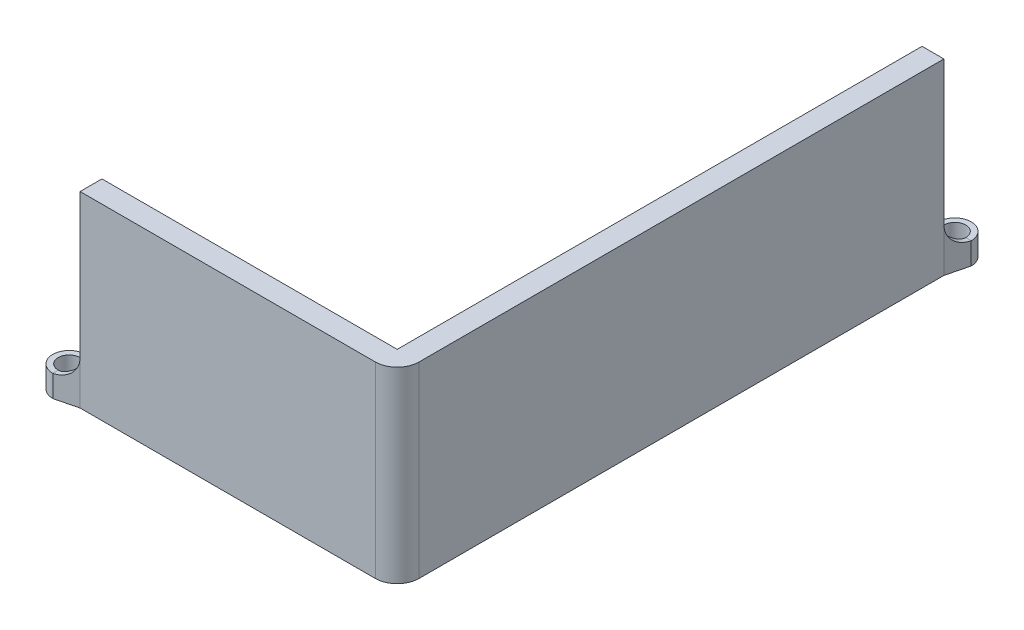
ISO-10303-21;
HEADER;
FILE_DESCRIPTION(('STEP AP214'),'2;1');
FILE_NAME('part.step','',(''),(''),'','','');
FILE_SCHEMA(('AUTOMOTIVE_DESIGN { 1 0 10303 214 1 1 1 1 }'));
ENDSEC;
DATA;
#1=APPLICATION_CONTEXT('core data for automotive mechanical design processes');
#2=APPLICATION_PROTOCOL_DEFINITION('international standard','automotive_design',2000,#1);
#3=PRODUCT_CONTEXT('',#1,'mechanical');
#4=PRODUCT('Part','Part','',(#3));
#5=PRODUCT_RELATED_PRODUCT_CATEGORY('part','',(#4));
#6=PRODUCT_DEFINITION_FORMATION('','',#4);
#7=PRODUCT_DEFINITION_CONTEXT('part definition',#1,'design');
#8=PRODUCT_DEFINITION('design','',#6,#7);
#9=PRODUCT_DEFINITION_SHAPE('','',#8);
#10=(LENGTH_UNIT() NAMED_UNIT(*) SI_UNIT(.MILLI.,.METRE.));
#11=(NAMED_UNIT(*) PLANE_ANGLE_UNIT() SI_UNIT($,.RADIAN.));
#12=(NAMED_UNIT(*) SI_UNIT($,.STERADIAN.) SOLID_ANGLE_UNIT());
#13=UNCERTAINTY_MEASURE_WITH_UNIT(LENGTH_MEASURE(1.E-05),#10,'distance_accuracy_value','');
#14=(GEOMETRIC_REPRESENTATION_CONTEXT(3) GLOBAL_UNCERTAINTY_ASSIGNED_CONTEXT((#13)) GLOBAL_UNIT_ASSIGNED_CONTEXT((#10,
#11,#12)) REPRESENTATION_CONTEXT('',''));
#15=CARTESIAN_POINT('',(0.,0.,0.));
#16=DIRECTION('',(0.,0.,1.));
#17=DIRECTION('',(1.,0.,0.));
#18=AXIS2_PLACEMENT_3D('',#15,#16,#17);
#19=CARTESIAN_POINT('',(-13.6180758017493,-8.50000000000001,2.));
#20=DIRECTION('',(1.,0.,0.));
#21=DIRECTION('',(0.,0.,-1.));
#22=AXIS2_PLACEMENT_3D('',#19,#20,#21);
#23=PLANE('',#22);
#24=DIRECTION('',(0.,-1.,0.));
#25=VECTOR('',#24,1.);
#26=CARTESIAN_POINT('',(-13.6180758017493,-8.50000000000001,0.));
#27=LINE('',#26,#25);
#28=CARTESIAN_POINT('',(-13.6180758017493,8.65000000000001,0.));
#29=VERTEX_POINT('',#28);
#30=CARTESIAN_POINT('',(-13.6180758017493,-4.50000000000001,0.));
#31=VERTEX_POINT('',#30);
#32=EDGE_CURVE('E346',#29,#31,#27,.T.);
#33=ORIENTED_EDGE('',*,*,#32,.T.);
#34=DIRECTION('',(0.,0.,-1.));
#35=VECTOR('',#34,1.);
#36=CARTESIAN_POINT('',(-13.6180758017493,-4.50000000000001,2.));
#37=LINE('',#36,#35);
#38=CARTESIAN_POINT('',(-13.6180758017493,-4.50000000000001,2.));
#39=VERTEX_POINT('',#38);
#40=EDGE_CURVE('E191',#31,#39,#37,.F.);
#41=ORIENTED_EDGE('',*,*,#40,.T.);
#42=DIRECTION('',(0.,-1.,0.));
#43=VECTOR('',#42,1.);
#44=CARTESIAN_POINT('',(-13.6180758017493,-8.50000000000001,2.));
#45=LINE('',#44,#43);
#46=CARTESIAN_POINT('',(-13.6180758017493,8.65000000000001,2.));
#47=VERTEX_POINT('',#46);
#48=EDGE_CURVE('E332',#47,#39,#45,.T.);
#49=ORIENTED_EDGE('',*,*,#48,.F.);
#50=DIRECTION('',(0.,0.,-1.));
#51=VECTOR('',#50,1.);
#52=CARTESIAN_POINT('',(-13.6180758017493,8.65000000000001,2.));
#53=LINE('',#52,#51);
#54=EDGE_CURVE('E340',#47,#29,#53,.T.);
#55=ORIENTED_EDGE('',*,*,#54,.T.);
#56=EDGE_LOOP('',(#33,#41,#49,#55));
#57=FACE_BOUND('',#56,.T.);
#58=ADVANCED_FACE('F45',(#57),#23,.F.);
#59=CARTESIAN_POINT('',(-13.6180758017493,8.65000000000001,2.));
#60=DIRECTION('',(0.,-1.,0.));
#61=DIRECTION('',(1.,0.,0.));
#62=AXIS2_PLACEMENT_3D('',#59,#60,#61);
#63=PLANE('',#62);
#64=DIRECTION('',(-1.,0.,0.));
#65=VECTOR('',#64,1.);
#66=CARTESIAN_POINT('',(-13.6180758017493,8.65000000000001,2.));
#67=LINE('',#66,#65);
#68=CARTESIAN_POINT('',(13.3819241982507,8.65000000000001,2.));
#69=VERTEX_POINT('',#68);
#70=EDGE_CURVE('E329',#69,#47,#67,.T.);
#71=ORIENTED_EDGE('',*,*,#70,.F.);
#72=CARTESIAN_POINT('',(13.3819241982507,8.65000000000001,0.));
#73=DIRECTION('',(0.,-1.,0.));
#74=DIRECTION('',(1.,0.,0.));
#75=AXIS2_PLACEMENT_3D('',#72,#73,#74);
#76=CIRCLE('',#75,2.);
#77=CARTESIAN_POINT('',(15.3819241982507,8.65000000000001,0.));
#78=VERTEX_POINT('',#77);
#79=EDGE_CURVE('E198',#69,#78,#76,.F.);
#80=ORIENTED_EDGE('',*,*,#79,.T.);
#81=DIRECTION('',(0.,0.,-1.));
#82=VECTOR('',#81,1.);
#83=CARTESIAN_POINT('',(15.3819241982507,8.65000000000001,0.));
#84=LINE('',#83,#82);
#85=CARTESIAN_POINT('',(15.3819241982507,8.65000000000001,-48.));
#86=VERTEX_POINT('',#85);
#87=EDGE_CURVE('E369',#78,#86,#84,.T.);
#88=ORIENTED_EDGE('',*,*,#87,.T.);
#89=DIRECTION('',(-1.,0.,0.));
#90=VECTOR('',#89,1.);
#91=CARTESIAN_POINT('',(15.3819241982507,8.65000000000001,-48.));
#92=LINE('',#91,#90);
#93=CARTESIAN_POINT('',(13.3819241982507,8.65000000000001,-48.));
#94=VERTEX_POINT('',#93);
#95=EDGE_CURVE('E325',#86,#94,#92,.T.);
#96=ORIENTED_EDGE('',*,*,#95,.T.);
#97=DIRECTION('',(0.,0.,-1.));
#98=VECTOR('',#97,1.);
#99=CARTESIAN_POINT('',(13.3819241982507,8.65000000000001,0.));
#100=LINE('',#99,#98);
#101=CARTESIAN_POINT('',(13.3819241982507,8.65000000000001,0.));
#102=VERTEX_POINT('',#101);
#103=EDGE_CURVE('E308',#102,#94,#100,.T.);
#104=ORIENTED_EDGE('',*,*,#103,.F.);
#105=DIRECTION('',(-1.,0.,0.));
#106=VECTOR('',#105,1.);
#107=CARTESIAN_POINT('',(-13.6180758017493,8.65000000000001,0.));
#108=LINE('',#107,#106);
#109=EDGE_CURVE('E343',#102,#29,#108,.T.);
#110=ORIENTED_EDGE('',*,*,#109,.T.);
#111=ORIENTED_EDGE('',*,*,#54,.F.);
#112=EDGE_LOOP('',(#71,#80,#88,#96,#104,#110,#111));
#113=FACE_BOUND('',#112,.T.);
#114=ADVANCED_FACE('F232',(#113),#63,.F.);
#115=CARTESIAN_POINT('',(-13.6180758017493,-8.50000000000001,2.));
#116=DIRECTION('',(0.,1.,0.));
#117=DIRECTION('',(0.,0.,1.));
#118=AXIS2_PLACEMENT_3D('',#115,#116,#117);
#119=PLANE('',#118);
#120=DIRECTION('',(0.,0.,-1.));
#121=VECTOR('',#120,1.);
#122=CARTESIAN_POINT('',(15.3819241982507,-8.50000000000001,0.));
#123=LINE('',#122,#121);
#124=CARTESIAN_POINT('',(15.3819241982507,-8.50000000000001,0.));
#125=VERTEX_POINT('',#124);
#126=CARTESIAN_POINT('',(15.3819241982507,-8.50000000000001,-48.));
#127=VERTEX_POINT('',#126);
#128=EDGE_CURVE('E320',#125,#127,#123,.T.);
#129=ORIENTED_EDGE('',*,*,#128,.F.);
#130=CARTESIAN_POINT('',(13.3819241982507,-8.50000000000001,0.));
#131=DIRECTION('',(0.,1.,0.));
#132=DIRECTION('',(0.,0.,1.));
#133=AXIS2_PLACEMENT_3D('',#130,#131,#132);
#134=CIRCLE('',#133,2.);
#135=CARTESIAN_POINT('',(13.3819241982507,-8.50000000000001,2.));
#136=VERTEX_POINT('',#135);
#137=EDGE_CURVE('E359',#125,#136,#134,.F.);
#138=ORIENTED_EDGE('',*,*,#137,.T.);
#139=DIRECTION('',(1.,0.,0.));
#140=VECTOR('',#139,1.);
#141=CARTESIAN_POINT('',(-13.6180758017493,-8.50000000000001,2.));
#142=LINE('',#141,#140);
#143=CARTESIAN_POINT('',(-13.6180758017493,-8.50000000000001,2.));
#144=VERTEX_POINT('',#143);
#145=EDGE_CURVE('E337',#144,#136,#142,.T.);
#146=ORIENTED_EDGE('',*,*,#145,.F.);
#147=DIRECTION('',(0.970142500145332,0.,-0.242535625036333));
#148=VECTOR('',#147,1.);
#149=CARTESIAN_POINT('',(-0.330475047161722,-8.50000000000001,-1.32190018864689));
#150=LINE('',#149,#148);
#151=CARTESIAN_POINT('',(-15.6180758017493,-8.50000000000001,2.5));
#152=VERTEX_POINT('',#151);
#153=EDGE_CURVE('E413',#152,#144,#150,.T.);
#154=ORIENTED_EDGE('',*,*,#153,.F.);
#155=CARTESIAN_POINT('',(-15.6180758017493,-8.50000000000001,1.));
#156=DIRECTION('',(0.,-1.,0.));
#157=DIRECTION('',(0.,0.,-1.));
#158=AXIS2_PLACEMENT_3D('',#155,#156,#157);
#159=CIRCLE('',#158,1.5);
#160=CARTESIAN_POINT('',(-15.6180758017493,-8.50000000000001,-0.5));
#161=VERTEX_POINT('',#160);
#162=EDGE_CURVE('E171',#152,#161,#159,.T.);
#163=ORIENTED_EDGE('',*,*,#162,.T.);
#164=DIRECTION('',(0.970142500145332,0.,0.242535625036333));
#165=VECTOR('',#164,1.);
#166=CARTESIAN_POINT('',(-0.801063282455839,-8.50000000000001,3.20425312982336));
#167=LINE('',#166,#165);
#168=CARTESIAN_POINT('',(-13.6180758017493,-8.50000000000001,0.));
#169=VERTEX_POINT('',#168);
#170=EDGE_CURVE('E415',#161,#169,#167,.T.);
#171=ORIENTED_EDGE('',*,*,#170,.T.);
#172=DIRECTION('',(1.,0.,0.));
#173=VECTOR('',#172,1.);
#174=CARTESIAN_POINT('',(-13.6180758017493,-8.50000000000001,0.));
#175=LINE('',#174,#173);
#176=CARTESIAN_POINT('',(13.3819241982507,-8.50000000000001,0.));
#177=VERTEX_POINT('',#176);
#178=EDGE_CURVE('E333',#169,#177,#175,.T.);
#179=ORIENTED_EDGE('',*,*,#178,.T.);
#180=DIRECTION('',(0.,0.,-1.));
#181=VECTOR('',#180,1.);
#182=CARTESIAN_POINT('',(13.3819241982507,-8.50000000000001,0.));
#183=LINE('',#182,#181);
#184=CARTESIAN_POINT('',(13.3819241982507,-8.50000000000001,-48.));
#185=VERTEX_POINT('',#184);
#186=EDGE_CURVE('E315',#177,#185,#183,.T.);
#187=ORIENTED_EDGE('',*,*,#186,.T.);
#188=DIRECTION('',(0.242535625036332,0.,0.970142500145332));
#189=VECTOR('',#188,1.);
#190=CARTESIAN_POINT('',(23.8888698336477,-8.50000000000001,-5.97221745841191));
#191=LINE('',#190,#189);
#192=CARTESIAN_POINT('',(12.8819241982507,-8.50000000000001,-50.));
#193=VERTEX_POINT('',#192);
#194=EDGE_CURVE('E393',#193,#185,#191,.T.);
#195=ORIENTED_EDGE('',*,*,#194,.F.);
#196=CARTESIAN_POINT('',(14.3819241982507,-8.50000000000001,-50.));
#197=DIRECTION('',(0.,-1.,0.));
#198=DIRECTION('',(0.,0.,-1.));
#199=AXIS2_PLACEMENT_3D('',#196,#197,#198);
#200=CIRCLE('',#199,1.5);
#201=CARTESIAN_POINT('',(15.8819241982507,-8.50000000000001,-50.));
#202=VERTEX_POINT('',#201);
#203=EDGE_CURVE('E397',#193,#202,#200,.T.);
#204=ORIENTED_EDGE('',*,*,#203,.T.);
#205=DIRECTION('',(-0.242535625036331,0.,0.970142500145332));
#206=VECTOR('',#205,1.);
#207=CARTESIAN_POINT('',(3.18298748070665,-8.50000000000001,0.795746870176657));
#208=LINE('',#207,#206);
#209=EDGE_CURVE('E401',#202,#127,#208,.T.);
#210=ORIENTED_EDGE('',*,*,#209,.T.);
#211=EDGE_LOOP('',(#129,#138,#146,#154,#163,#171,#179,#187,#195,#204,#210));
#212=FACE_BOUND('',#211,.T.);
#213=CARTESIAN_POINT('',(14.3819241982507,-8.50000000000001,-50.));
#214=DIRECTION('',(0.,-1.,0.));
#215=DIRECTION('',(0.,0.,-1.));
#216=AXIS2_PLACEMENT_3D('',#213,#214,#215);
#217=CIRCLE('',#216,1.);
#218=CARTESIAN_POINT('',(14.3819241982507,-8.50000000000001,-51.));
#219=VERTEX_POINT('',#218);
#220=EDGE_CURVE('E388',#219,#219,#217,.T.);
#221=ORIENTED_EDGE('',*,*,#220,.F.);
#222=EDGE_LOOP('',(#221));
#223=FACE_BOUND('',#222,.T.);
#224=CARTESIAN_POINT('',(-15.6180758017493,-8.50000000000001,1.));
#225=DIRECTION('',(0.,-1.,0.));
#226=DIRECTION('',(0.,0.,-1.));
#227=AXIS2_PLACEMENT_3D('',#224,#225,#226);
#228=CIRCLE('',#227,1.);
#229=CARTESIAN_POINT('',(-15.6180758017493,-8.50000000000001,0.));
#230=VERTEX_POINT('',#229);
#231=EDGE_CURVE('E417',#230,#230,#228,.T.);
#232=ORIENTED_EDGE('',*,*,#231,.F.);
#233=EDGE_LOOP('',(#232));
#234=FACE_BOUND('',#233,.T.);
#235=ADVANCED_FACE('F235',(#212,#223,#234),#119,.F.);
#236=CARTESIAN_POINT('',(0.,0.,2.));
#237=DIRECTION('',(0.,0.,-1.));
#238=DIRECTION('',(-1.,0.,0.));
#239=AXIS2_PLACEMENT_3D('',#236,#237,#238);
#240=PLANE('',#239);
#241=ORIENTED_EDGE('',*,*,#145,.T.);
#242=DIRECTION('',(0.,-1.,0.));
#243=VECTOR('',#242,1.);
#244=CARTESIAN_POINT('',(13.3819241982507,8.65000000000001,2.));
#245=LINE('',#244,#243);
#246=EDGE_CURVE('E362',#136,#69,#245,.F.);
#247=ORIENTED_EDGE('',*,*,#246,.T.);
#248=ORIENTED_EDGE('',*,*,#70,.T.);
#249=ORIENTED_EDGE('',*,*,#48,.T.);
#250=DIRECTION('',(0.,-1.,0.));
#251=VECTOR('',#250,1.);
#252=CARTESIAN_POINT('',(-13.6180758017493,-6.50000000000001,2.));
#253=LINE('',#252,#251);
#254=EDGE_CURVE('E154',#39,#144,#253,.T.);
#255=ORIENTED_EDGE('',*,*,#254,.T.);
#256=EDGE_LOOP('',(#241,#247,#248,#249,#255));
#257=FACE_BOUND('',#256,.T.);
#258=ADVANCED_FACE('F242',(#257),#240,.F.);
#259=CARTESIAN_POINT('',(0.,0.,0.));
#260=DIRECTION('',(0.,0.,-1.));
#261=DIRECTION('',(-1.,0.,0.));
#262=AXIS2_PLACEMENT_3D('',#259,#260,#261);
#263=PLANE('',#262);
#264=DIRECTION('',(0.,1.,0.));
#265=VECTOR('',#264,1.);
#266=CARTESIAN_POINT('',(13.3819241982507,-8.50000000000001,0.));
#267=LINE('',#266,#265);
#268=EDGE_CURVE('E328',#177,#102,#267,.T.);
#269=ORIENTED_EDGE('',*,*,#268,.F.);
#270=ORIENTED_EDGE('',*,*,#178,.F.);
#271=DIRECTION('',(0.,-1.,0.));
#272=VECTOR('',#271,1.);
#273=CARTESIAN_POINT('',(-13.6180758017493,-6.50000000000001,0.));
#274=LINE('',#273,#272);
#275=EDGE_CURVE('E185',#31,#169,#274,.T.);
#276=ORIENTED_EDGE('',*,*,#275,.F.);
#277=ORIENTED_EDGE('',*,*,#32,.F.);
#278=ORIENTED_EDGE('',*,*,#109,.F.);
#279=EDGE_LOOP('',(#269,#270,#276,#277,#278));
#280=FACE_BOUND('',#279,.T.);
#281=ADVANCED_FACE('F244',(#280),#263,.T.);
#282=CARTESIAN_POINT('',(13.3819241982507,0.,0.));
#283=DIRECTION('',(1.,0.,0.));
#284=DIRECTION('',(0.,0.,-1.));
#285=AXIS2_PLACEMENT_3D('',#282,#283,#284);
#286=PLANE('',#285);
#287=ORIENTED_EDGE('',*,*,#186,.F.);
#288=ORIENTED_EDGE('',*,*,#268,.T.);
#289=ORIENTED_EDGE('',*,*,#103,.T.);
#290=DIRECTION('',(0.,-1.,0.));
#291=VECTOR('',#290,1.);
#292=CARTESIAN_POINT('',(13.3819241982507,0.,-48.));
#293=LINE('',#292,#291);
#294=CARTESIAN_POINT('',(13.3819241982507,-4.50000000000001,-48.));
#295=VERTEX_POINT('',#294);
#296=EDGE_CURVE('E300',#94,#295,#293,.T.);
#297=ORIENTED_EDGE('',*,*,#296,.T.);
#298=DIRECTION('',(0.,-1.,0.));
#299=VECTOR('',#298,1.);
#300=CARTESIAN_POINT('',(13.3819241982507,-6.50000000000001,-48.));
#301=LINE('',#300,#299);
#302=EDGE_CURVE('E304',#295,#185,#301,.T.);
#303=ORIENTED_EDGE('',*,*,#302,.T.);
#304=EDGE_LOOP('',(#287,#288,#289,#297,#303));
#305=FACE_BOUND('',#304,.T.);
#306=ADVANCED_FACE('F247',(#305),#286,.F.);
#307=CARTESIAN_POINT('',(15.3819241982507,0.,-48.));
#308=DIRECTION('',(0.,0.,-1.));
#309=DIRECTION('',(-1.,0.,0.));
#310=AXIS2_PLACEMENT_3D('',#307,#308,#309);
#311=PLANE('',#310);
#312=DIRECTION('',(0.,-1.,0.));
#313=VECTOR('',#312,1.);
#314=CARTESIAN_POINT('',(15.3819241982507,0.,-48.));
#315=LINE('',#314,#313);
#316=CARTESIAN_POINT('',(15.3819241982507,-4.50000000000001,-48.));
#317=VERTEX_POINT('',#316);
#318=EDGE_CURVE('E301',#86,#317,#315,.T.);
#319=ORIENTED_EDGE('',*,*,#318,.T.);
#320=DIRECTION('',(1.,0.,0.));
#321=VECTOR('',#320,1.);
#322=CARTESIAN_POINT('',(15.3819241982507,-4.50000000000001,-48.));
#323=LINE('',#322,#321);
#324=EDGE_CURVE('E208',#317,#295,#323,.F.);
#325=ORIENTED_EDGE('',*,*,#324,.T.);
#326=ORIENTED_EDGE('',*,*,#296,.F.);
#327=ORIENTED_EDGE('',*,*,#95,.F.);
#328=EDGE_LOOP('',(#319,#325,#326,#327));
#329=FACE_BOUND('',#328,.T.);
#330=ADVANCED_FACE('F252',(#329),#311,.T.);
#331=CARTESIAN_POINT('',(15.3819241982507,0.,0.));
#332=DIRECTION('',(1.,0.,0.));
#333=DIRECTION('',(0.,0.,-1.));
#334=AXIS2_PLACEMENT_3D('',#331,#332,#333);
#335=PLANE('',#334);
#336=ORIENTED_EDGE('',*,*,#87,.F.);
#337=DIRECTION('',(0.,-1.,0.));
#338=VECTOR('',#337,1.);
#339=CARTESIAN_POINT('',(15.3819241982507,-8.50000000000001,0.));
#340=LINE('',#339,#338);
#341=EDGE_CURVE('E355',#78,#125,#340,.T.);
#342=ORIENTED_EDGE('',*,*,#341,.T.);
#343=ORIENTED_EDGE('',*,*,#128,.T.);
#344=DIRECTION('',(0.,-1.,0.));
#345=VECTOR('',#344,1.);
#346=CARTESIAN_POINT('',(15.3819241982507,-6.50000000000001,-48.));
#347=LINE('',#346,#345);
#348=EDGE_CURVE('E63',#317,#127,#347,.T.);
#349=ORIENTED_EDGE('',*,*,#348,.F.);
#350=ORIENTED_EDGE('',*,*,#318,.F.);
#351=EDGE_LOOP('',(#336,#342,#343,#349,#350));
#352=FACE_BOUND('',#351,.T.);
#353=ADVANCED_FACE('F230',(#352),#335,.T.);
#354=CARTESIAN_POINT('',(13.3819241982507,0.,0.));
#355=DIRECTION('',(0.,1.,0.));
#356=DIRECTION('',(0.,0.,1.));
#357=AXIS2_PLACEMENT_3D('',#354,#355,#356);
#358=CYLINDRICAL_SURFACE('',#357,2.);
#359=ORIENTED_EDGE('',*,*,#79,.F.);
#360=ORIENTED_EDGE('',*,*,#246,.F.);
#361=ORIENTED_EDGE('',*,*,#137,.F.);
#362=ORIENTED_EDGE('',*,*,#341,.F.);
#363=EDGE_LOOP('',(#359,#360,#361,#362));
#364=FACE_BOUND('',#363,.T.);
#365=ADVANCED_FACE('F226',(#364),#358,.T.);
#366=CARTESIAN_POINT('',(23.8888698336477,-6.50000000000001,-5.97221745841191));
#367=DIRECTION('',(0.970142500145332,0.,-0.242535625036332));
#368=DIRECTION('',(-0.242535625036332,0.,-0.970142500145332));
#369=AXIS2_PLACEMENT_3D('',#366,#367,#368);
#370=PLANE('',#369);
#371=ORIENTED_EDGE('',*,*,#194,.T.);
#372=ORIENTED_EDGE('',*,*,#302,.F.);
#373=CARTESIAN_POINT('',(12.8819241982507,-4.50000000000001,-50.));
#374=DIRECTION('',(0.970142500145332,0.,-0.242535625036332));
#375=DIRECTION('',(0.242535625036332,0.,0.970142500145332));
#376=AXIS2_PLACEMENT_3D('',#373,#374,#375);
#377=ELLIPSE('',#376,2.06155281280883,2.);
#378=CARTESIAN_POINT('',(12.8819241982507,-6.50000000000001,-50.));
#379=VERTEX_POINT('',#378);
#380=EDGE_CURVE('E11',#295,#379,#377,.T.);
#381=ORIENTED_EDGE('',*,*,#380,.T.);
#382=DIRECTION('',(0.,-1.,0.));
#383=VECTOR('',#382,1.);
#384=CARTESIAN_POINT('',(12.8819241982507,-6.50000000000001,-50.));
#385=LINE('',#384,#383);
#386=EDGE_CURVE('E392',#379,#193,#385,.T.);
#387=ORIENTED_EDGE('',*,*,#386,.T.);
#388=EDGE_LOOP('',(#371,#372,#381,#387));
#389=FACE_BOUND('',#388,.T.);
#390=ADVANCED_FACE('F229',(#389),#370,.F.);
#391=CARTESIAN_POINT('',(3.18298748070665,-6.50000000000001,0.795746870176657));
#392=DIRECTION('',(0.970142500145332,0.,0.242535625036331));
#393=DIRECTION('',(0.242535625036331,0.,-0.970142500145332));
#394=AXIS2_PLACEMENT_3D('',#391,#392,#393);
#395=PLANE('',#394);
#396=ORIENTED_EDGE('',*,*,#209,.F.);
#397=DIRECTION('',(0.,-1.,0.));
#398=VECTOR('',#397,1.);
#399=CARTESIAN_POINT('',(15.8819241982507,-6.50000000000001,-50.));
#400=LINE('',#399,#398);
#401=CARTESIAN_POINT('',(15.8819241982507,-6.50000000000001,-50.));
#402=VERTEX_POINT('',#401);
#403=EDGE_CURVE('E291',#402,#202,#400,.T.);
#404=ORIENTED_EDGE('',*,*,#403,.F.);
#405=CARTESIAN_POINT('',(15.8819241982507,-4.50000000000001,-50.));
#406=DIRECTION('',(0.970142500145332,0.,0.242535625036331));
#407=DIRECTION('',(0.242535625036331,0.,-0.970142500145332));
#408=AXIS2_PLACEMENT_3D('',#405,#406,#407);
#409=ELLIPSE('',#408,2.06155281280883,2.);
#410=EDGE_CURVE('E56',#402,#317,#409,.F.);
#411=ORIENTED_EDGE('',*,*,#410,.T.);
#412=ORIENTED_EDGE('',*,*,#348,.T.);
#413=EDGE_LOOP('',(#396,#404,#411,#412));
#414=FACE_BOUND('',#413,.T.);
#415=ADVANCED_FACE('F263',(#414),#395,.T.);
#416=CARTESIAN_POINT('',(14.3819241982507,-6.50000000000001,-50.));
#417=DIRECTION('',(0.,-1.,0.));
#418=DIRECTION('',(0.,0.,-1.));
#419=AXIS2_PLACEMENT_3D('',#416,#417,#418);
#420=CYLINDRICAL_SURFACE('',#419,1.5);
#421=ORIENTED_EDGE('',*,*,#203,.F.);
#422=ORIENTED_EDGE('',*,*,#386,.F.);
#423=CARTESIAN_POINT('',(14.3819241982507,-6.50000000000001,-50.));
#424=DIRECTION('',(0.,-1.,0.));
#425=DIRECTION('',(0.,0.,-1.));
#426=AXIS2_PLACEMENT_3D('',#423,#424,#425);
#427=CIRCLE('',#426,1.5);
#428=EDGE_CURVE('E385',#379,#402,#427,.T.);
#429=ORIENTED_EDGE('',*,*,#428,.T.);
#430=ORIENTED_EDGE('',*,*,#403,.T.);
#431=EDGE_LOOP('',(#421,#422,#429,#430));
#432=FACE_BOUND('',#431,.T.);
#433=ADVANCED_FACE('F265',(#432),#420,.T.);
#434=CARTESIAN_POINT('',(14.3819241982507,-6.50000000000001,-50.));
#435=DIRECTION('',(0.,-1.,0.));
#436=DIRECTION('',(0.,0.,-1.));
#437=AXIS2_PLACEMENT_3D('',#434,#435,#436);
#438=CYLINDRICAL_SURFACE('',#437,1.);
#439=CARTESIAN_POINT('',(14.3819241982507,-6.50000000000001,-50.));
#440=DIRECTION('',(0.,-1.,0.));
#441=DIRECTION('',(0.,0.,-1.));
#442=AXIS2_PLACEMENT_3D('',#439,#440,#441);
#443=CIRCLE('',#442,1.);
#444=CARTESIAN_POINT('',(13.3819241982507,-6.50000000000001,-50.));
#445=VERTEX_POINT('',#444);
#446=CARTESIAN_POINT('',(15.3819241982507,-6.50000000000001,-50.));
#447=VERTEX_POINT('',#446);
#448=EDGE_CURVE('E387',#445,#447,#443,.T.);
#449=ORIENTED_EDGE('',*,*,#448,.F.);
#450=CARTESIAN_POINT('',(13.3819241982507,-6.50000000000001,-50.));
#451=CARTESIAN_POINT('',(13.3819227955202,-6.50000269946716,-49.9735948077034));
#452=CARTESIAN_POINT('',(13.3829707665138,-6.49947649716798,-49.9472036520922));
#453=CARTESIAN_POINT('',(13.3871410325556,-6.49739548241972,-49.8946369973913));
#454=CARTESIAN_POINT('',(13.3902624945881,-6.49584108304528,-49.8684614159694));
#455=CARTESIAN_POINT('',(13.4026571146314,-6.48970082418063,-49.7907872526912));
#456=CARTESIAN_POINT('',(13.4149611271375,-6.48363725114636,-49.7398530951311));
#457=CARTESIAN_POINT('',(13.4471094259117,-6.46816726842188,-49.6410822692348));
#458=CARTESIAN_POINT('',(13.4669450884225,-6.45876468270353,-49.5932421312851));
#459=CARTESIAN_POINT('',(13.5134658730641,-6.43747056331368,-49.5015778196361));
#460=CARTESIAN_POINT('',(13.5401578404674,-6.42557654442051,-49.4577577191899));
#461=CARTESIAN_POINT('',(13.601443119084,-6.39956190172718,-49.372488998072));
#462=CARTESIAN_POINT('',(13.6364143256194,-6.38535051613387,-49.3313402655673));
#463=CARTESIAN_POINT('',(13.7124499384799,-6.35659818763131,-49.2552171611083));
#464=CARTESIAN_POINT('',(13.7535183173906,-6.3420570351368,-49.2202468474539));
#465=CARTESIAN_POINT('',(13.8444081089623,-6.31298933446051,-49.1547475255989));
#466=CARTESIAN_POINT('',(13.8946614975898,-6.29855152537611,-49.1247739300601));
#467=CARTESIAN_POINT('',(14.0002928579138,-6.27285951753638,-49.0738312896018));
#468=CARTESIAN_POINT('',(14.0556670107007,-6.26160297130255,-49.0528555991083));
#469=CARTESIAN_POINT('',(14.1665886919371,-6.2445787641064,-49.0218677239291));
#470=CARTESIAN_POINT('',(14.2219273899908,-6.23852285222135,-49.0112743815781));
#471=CARTESIAN_POINT('',(14.3339017466554,-6.23181891602507,-48.9995730347665));
#472=CARTESIAN_POINT('',(14.3905360998552,-6.2311656698563,-48.9984558712346));
#473=CARTESIAN_POINT('',(14.4962107594095,-6.23510932236025,-49.0053127467042));
#474=CARTESIAN_POINT('',(14.5453492951127,-6.23908772332738,-49.0122155887197));
#475=CARTESIAN_POINT('',(14.6416471314673,-6.25076245394119,-49.0330604550174));
#476=CARTESIAN_POINT('',(14.6888058399225,-6.25845988751499,-49.0470045694287));
#477=CARTESIAN_POINT('',(14.781152683654,-6.27687463485512,-49.0817899693375));
#478=CARTESIAN_POINT('',(14.826269344758,-6.28765810604009,-49.1027843255804));
#479=CARTESIAN_POINT('',(14.9125573566277,-6.31103369680029,-49.1509575871545));
#480=CARTESIAN_POINT('',(14.9537268133975,-6.32362667746669,-49.1781394405476));
#481=CARTESIAN_POINT('',(15.0364440832088,-6.35113112116197,-49.2419327936044));
#482=CARTESIAN_POINT('',(15.0773784754602,-6.36613414138213,-49.2793028008289));
#483=CARTESIAN_POINT('',(15.1526575619626,-6.39547538192715,-49.3604421486319));
#484=CARTESIAN_POINT('',(15.1869986982835,-6.4098132401625,-49.4042149220255));
#485=CARTESIAN_POINT('',(15.2496258089266,-6.43702678121635,-49.499506473959));
#486=CARTESIAN_POINT('',(15.2775519334265,-6.44980225177332,-49.5512923848146));
#487=CARTESIAN_POINT('',(15.3240412679907,-6.47158856967769,-49.6595979435401));
#488=CARTESIAN_POINT('',(15.3426213108492,-6.48060618006931,-49.7161088656938));
#489=CARTESIAN_POINT('',(15.3646115731507,-6.49138632543685,-49.8108983931179));
#490=CARTESIAN_POINT('',(15.3710816786373,-6.49459484825626,-49.8483281553093));
#491=CARTESIAN_POINT('',(15.3797460794436,-6.4989107546555,-49.9238275392058));
#492=CARTESIAN_POINT('',(15.3819369018349,-6.5000164316142,-49.9618976553525));
#493=CARTESIAN_POINT('',(15.3819241982507,-6.50000000000001,-50.));
#494=B_SPLINE_CURVE_WITH_KNOTS('',3,(#450,#451,#452,#453,#454,#455,#456,#457,#458,#459,#460,
#461,#462,#463,#464,#465,#466,#467,#468,#469,#470,#471,#472,#473,#474,#475,#476,#477,#478,#479,
#480,#481,#482,#483,#484,#485,#486,#487,#488,#489,#490,#491,#492,#493),.UNSPECIFIED.,.F.,.F.,(4,
2,2,2,2,2,2,2,2,2,2,2,2,2,2,2,2,2,2,2,2,4),(0.,0.0791624071485603,0.158293030372253,
0.315701742302616,0.472930761738357,0.630317371504209,0.797144021853112,0.964079848299636,
1.14397301600195,1.32373309046489,1.49273181845563,1.6615671843976,1.81021234232053,
1.95890164998501,2.11105391388271,2.26327882374109,2.43479774097341,2.60640895669909,
2.78607476153255,2.96541580950668,3.07949288403012,3.19366250143093),.UNSPECIFIED.);
#495=EDGE_CURVE('E160',#445,#447,#494,.T.);
#496=ORIENTED_EDGE('',*,*,#495,.T.);
#497=EDGE_LOOP('',(#449,#496));
#498=FACE_BOUND('',#497,.T.);
#499=ORIENTED_EDGE('',*,*,#220,.T.);
#500=EDGE_LOOP('',(#499));
#501=FACE_BOUND('',#500,.T.);
#502=ADVANCED_FACE('F268',(#498,#501),#438,.F.);
#503=CARTESIAN_POINT('',(0.,-6.50000000000001,0.));
#504=DIRECTION('',(0.,-1.,0.));
#505=DIRECTION('',(0.,0.,-1.));
#506=AXIS2_PLACEMENT_3D('',#503,#504,#505);
#507=PLANE('',#506);
#508=ORIENTED_EDGE('',*,*,#428,.F.);
#509=DIRECTION('',(1.,0.,0.));
#510=VECTOR('',#509,1.);
#511=CARTESIAN_POINT('',(0.,-6.50000000000001,-50.));
#512=LINE('',#511,#510);
#513=EDGE_CURVE('E204',#379,#445,#512,.T.);
#514=ORIENTED_EDGE('',*,*,#513,.T.);
#515=ORIENTED_EDGE('',*,*,#448,.T.);
#516=DIRECTION('',(1.,0.,0.));
#517=VECTOR('',#516,1.);
#518=CARTESIAN_POINT('',(0.,-6.50000000000001,-50.));
#519=LINE('',#518,#517);
#520=EDGE_CURVE('E195',#447,#402,#519,.T.);
#521=ORIENTED_EDGE('',*,*,#520,.T.);
#522=EDGE_LOOP('',(#508,#514,#515,#521));
#523=FACE_BOUND('',#522,.T.);
#524=ADVANCED_FACE('F275',(#523),#507,.F.);
#525=CARTESIAN_POINT('',(-0.801063282455839,-6.50000000000001,3.20425312982336));
#526=DIRECTION('',(0.242535625036333,0.,-0.970142500145332));
#527=DIRECTION('',(-0.970142500145332,0.,-0.242535625036333));
#528=AXIS2_PLACEMENT_3D('',#525,#526,#527);
#529=PLANE('',#528);
#530=ORIENTED_EDGE('',*,*,#170,.F.);
#531=DIRECTION('',(0.,-1.,0.));
#532=VECTOR('',#531,1.);
#533=CARTESIAN_POINT('',(-15.6180758017493,-6.50000000000001,-0.5));
#534=LINE('',#533,#532);
#535=CARTESIAN_POINT('',(-15.6180758017493,-6.50000000000001,-0.5));
#536=VERTEX_POINT('',#535);
#537=EDGE_CURVE('E173',#536,#161,#534,.T.);
#538=ORIENTED_EDGE('',*,*,#537,.F.);
#539=CARTESIAN_POINT('',(-15.6180758017493,-4.50000000000001,-0.5));
#540=DIRECTION('',(0.242535625036333,0.,-0.970142500145332));
#541=DIRECTION('',(0.970142500145332,0.,0.242535625036333));
#542=AXIS2_PLACEMENT_3D('',#539,#540,#541);
#543=ELLIPSE('',#542,2.06155281280883,2.);
#544=EDGE_CURVE('E161',#536,#31,#543,.F.);
#545=ORIENTED_EDGE('',*,*,#544,.T.);
#546=ORIENTED_EDGE('',*,*,#275,.T.);
#547=EDGE_LOOP('',(#530,#538,#545,#546));
#548=FACE_BOUND('',#547,.T.);
#549=ADVANCED_FACE('F431',(#548),#529,.T.);
#550=CARTESIAN_POINT('',(-15.6180758017493,-6.50000000000001,1.));
#551=DIRECTION('',(0.,-1.,0.));
#552=DIRECTION('',(0.,0.,-1.));
#553=AXIS2_PLACEMENT_3D('',#550,#551,#552);
#554=CYLINDRICAL_SURFACE('',#553,1.5);
#555=ORIENTED_EDGE('',*,*,#162,.F.);
#556=DIRECTION('',(0.,-1.,0.));
#557=VECTOR('',#556,1.);
#558=CARTESIAN_POINT('',(-15.6180758017493,-6.50000000000001,2.5));
#559=LINE('',#558,#557);
#560=CARTESIAN_POINT('',(-15.6180758017493,-6.50000000000001,2.5));
#561=VERTEX_POINT('',#560);
#562=EDGE_CURVE('E152',#561,#152,#559,.T.);
#563=ORIENTED_EDGE('',*,*,#562,.F.);
#564=CARTESIAN_POINT('',(-15.6180758017493,-6.50000000000001,1.));
#565=DIRECTION('',(0.,-1.,0.));
#566=DIRECTION('',(0.,0.,-1.));
#567=AXIS2_PLACEMENT_3D('',#564,#565,#566);
#568=CIRCLE('',#567,1.5);
#569=EDGE_CURVE('E168',#561,#536,#568,.T.);
#570=ORIENTED_EDGE('',*,*,#569,.T.);
#571=ORIENTED_EDGE('',*,*,#537,.T.);
#572=EDGE_LOOP('',(#555,#563,#570,#571));
#573=FACE_BOUND('',#572,.T.);
#574=ADVANCED_FACE('F167',(#573),#554,.T.);
#575=CARTESIAN_POINT('',(-0.330475047161722,-6.50000000000001,-1.32190018864689));
#576=DIRECTION('',(-0.242535625036333,0.,-0.970142500145332));
#577=DIRECTION('',(-0.970142500145332,0.,0.242535625036333));
#578=AXIS2_PLACEMENT_3D('',#575,#576,#577);
#579=PLANE('',#578);
#580=ORIENTED_EDGE('',*,*,#153,.T.);
#581=ORIENTED_EDGE('',*,*,#254,.F.);
#582=CARTESIAN_POINT('',(-15.6180758017493,-4.50000000000001,2.5));
#583=DIRECTION('',(-0.242535625036333,0.,-0.970142500145332));
#584=DIRECTION('',(-0.970142500145332,0.,0.242535625036333));
#585=AXIS2_PLACEMENT_3D('',#582,#583,#584);
#586=ELLIPSE('',#585,2.06155281280883,2.);
#587=EDGE_CURVE('E148',#39,#561,#586,.T.);
#588=ORIENTED_EDGE('',*,*,#587,.T.);
#589=ORIENTED_EDGE('',*,*,#562,.T.);
#590=EDGE_LOOP('',(#580,#581,#588,#589));
#591=FACE_BOUND('',#590,.T.);
#592=ADVANCED_FACE('F151',(#591),#579,.F.);
#593=CARTESIAN_POINT('',(-15.6180758017493,-6.50000000000001,1.));
#594=DIRECTION('',(0.,-1.,0.));
#595=DIRECTION('',(0.,0.,-1.));
#596=AXIS2_PLACEMENT_3D('',#593,#594,#595);
#597=CYLINDRICAL_SURFACE('',#596,1.);
#598=CARTESIAN_POINT('',(-15.6180758017493,-6.50000000000001,1.));
#599=DIRECTION('',(0.,-1.,0.));
#600=DIRECTION('',(0.,0.,-1.));
#601=AXIS2_PLACEMENT_3D('',#598,#599,#600);
#602=CIRCLE('',#601,1.);
#603=CARTESIAN_POINT('',(-15.6180758017493,-6.50000000000001,2.));
#604=VERTEX_POINT('',#603);
#605=CARTESIAN_POINT('',(-15.6180758017493,-6.50000000000001,0.));
#606=VERTEX_POINT('',#605);
#607=EDGE_CURVE('E186',#604,#606,#602,.T.);
#608=ORIENTED_EDGE('',*,*,#607,.F.);
#609=CARTESIAN_POINT('',(-15.6180758017493,-6.50000000000001,2.));
#610=CARTESIAN_POINT('',(-15.5916706094527,-6.50000269946715,2.00000140273049));
#611=CARTESIAN_POINT('',(-15.5652794538415,-6.49947649716798,1.99895343173695));
#612=CARTESIAN_POINT('',(-15.5127127991406,-6.49739548241972,1.99478316569516));
#613=CARTESIAN_POINT('',(-15.4865372177187,-6.49584108304528,1.99166170366266));
#614=CARTESIAN_POINT('',(-15.4088630544404,-6.48970082418064,1.9792670836193));
#615=CARTESIAN_POINT('',(-15.3579288968804,-6.48363725114636,1.96696307111327));
#616=CARTESIAN_POINT('',(-15.2591580709841,-6.46816726842188,1.93481477233904));
#617=CARTESIAN_POINT('',(-15.2113179330344,-6.45876468270353,1.91497910982818));
#618=CARTESIAN_POINT('',(-15.1196536213853,-6.43747056331368,1.86845832518665));
#619=CARTESIAN_POINT('',(-15.0758335209391,-6.42557654442051,1.8417663577833));
#620=CARTESIAN_POINT('',(-14.9905647998213,-6.39956190172718,1.78048107916673));
#621=CARTESIAN_POINT('',(-14.9494160673166,-6.38535051613387,1.74550987263135));
#622=CARTESIAN_POINT('',(-14.8732929628576,-6.35659818763131,1.66947425977087));
#623=CARTESIAN_POINT('',(-14.8383226492032,-6.3420570351368,1.62840588086014));
#624=CARTESIAN_POINT('',(-14.7728233273481,-6.31298933446052,1.53751608928843));
#625=CARTESIAN_POINT('',(-14.7428497318094,-6.29855152537611,1.48726270066095));
#626=CARTESIAN_POINT('',(-14.6919070913511,-6.27285951753638,1.38163134033696));
#627=CARTESIAN_POINT('',(-14.6709314008576,-6.26160297130256,1.32625718755001));
#628=CARTESIAN_POINT('',(-14.6399435256784,-6.2445787641064,1.21533550631358));
#629=CARTESIAN_POINT('',(-14.6293501833274,-6.23852285222135,1.15999680825996));
#630=CARTESIAN_POINT('',(-14.6176488365158,-6.23181891602507,1.04802245159529));
#631=CARTESIAN_POINT('',(-14.6165316729839,-6.2311656698563,0.991388098395568));
#632=CARTESIAN_POINT('',(-14.6233885484535,-6.23510932236025,0.885713438841202));
#633=CARTESIAN_POINT('',(-14.630291390469,-6.23908772332738,0.836574903137988));
#634=CARTESIAN_POINT('',(-14.6511362567667,-6.25076245394119,0.740277066783466));
#635=CARTESIAN_POINT('',(-14.665080371178,-6.25845988751499,0.693118358328205));
#636=CARTESIAN_POINT('',(-14.6998657710868,-6.27687463485513,0.600771514596779));
#637=CARTESIAN_POINT('',(-14.7208601273297,-6.2876581060401,0.555654853492696));
#638=CARTESIAN_POINT('',(-14.7690333889037,-6.31103369680029,0.46936684162306));
#639=CARTESIAN_POINT('',(-14.7962152422969,-6.32362667746669,0.428197384853259));
#640=CARTESIAN_POINT('',(-14.8600085953537,-6.35113112116197,0.345480115041958));
#641=CARTESIAN_POINT('',(-14.8973786025782,-6.36613414138213,0.304545722790579));
#642=CARTESIAN_POINT('',(-14.9785179503812,-6.39547538192715,0.229266636288112));
#643=CARTESIAN_POINT('',(-15.0222907237748,-6.40981324016251,0.194925499967186));
#644=CARTESIAN_POINT('',(-15.1175822757083,-6.43702678121635,0.132298389324168));
#645=CARTESIAN_POINT('',(-15.1693681865639,-6.44980225177332,0.104372264824192));
#646=CARTESIAN_POINT('',(-15.2776737452894,-6.47158856967769,0.0578829302600782));
#647=CARTESIAN_POINT('',(-15.334184667443,-6.48060618006931,0.0393028874015304));
#648=CARTESIAN_POINT('',(-15.4289741948672,-6.49138632543685,0.0173126251000237));
#649=CARTESIAN_POINT('',(-15.4664039570586,-6.49459484825626,0.0108425196134333));
#650=CARTESIAN_POINT('',(-15.5419033409551,-6.4989107546555,0.00217811880712866));
#651=CARTESIAN_POINT('',(-15.5799734571017,-6.5000164316142,-1.27035841982444E-05));
#652=CARTESIAN_POINT('',(-15.6180758017493,-6.50000000000001,0.));
#653=B_SPLINE_CURVE_WITH_KNOTS('',3,(#609,#610,#611,#612,#613,#614,#615,#616,#617,#618,#619,
#620,#621,#622,#623,#624,#625,#626,#627,#628,#629,#630,#631,#632,#633,#634,#635,#636,#637,#638,
#639,#640,#641,#642,#643,#644,#645,#646,#647,#648,#649,#650,#651,#652),.UNSPECIFIED.,.F.,.F.,(4,
2,2,2,2,2,2,2,2,2,2,2,2,2,2,2,2,2,2,2,2,4),(0.,0.0791624071485499,0.158293030372248,
0.315701742302616,0.472930761738356,0.630317371504209,0.797144021853119,0.964079848299631,
1.14397301600195,1.32373309046488,1.49273181845563,1.66156718439759,1.81021234232052,
1.95890164998501,2.1110539138827,2.26327882374108,2.4347977409734,2.60640895669908,
2.78607476153254,2.96541580950667,3.07949288403011,3.19366250143091),.UNSPECIFIED.);
#654=EDGE_CURVE('E189',#604,#606,#653,.T.);
#655=ORIENTED_EDGE('',*,*,#654,.T.);
#656=EDGE_LOOP('',(#608,#655));
#657=FACE_BOUND('',#656,.T.);
#658=ORIENTED_EDGE('',*,*,#231,.T.);
#659=EDGE_LOOP('',(#658));
#660=FACE_BOUND('',#659,.T.);
#661=ADVANCED_FACE('F219',(#657,#660),#597,.F.);
#662=CARTESIAN_POINT('',(0.,-6.50000000000001,0.));
#663=DIRECTION('',(0.,-1.,0.));
#664=DIRECTION('',(0.,0.,-1.));
#665=AXIS2_PLACEMENT_3D('',#662,#663,#664);
#666=PLANE('',#665);
#667=ORIENTED_EDGE('',*,*,#569,.F.);
#668=DIRECTION('',(0.,0.,-1.));
#669=VECTOR('',#668,1.);
#670=CARTESIAN_POINT('',(-15.6180758017493,-6.50000000000001,0.));
#671=LINE('',#670,#669);
#672=EDGE_CURVE('E179',#561,#604,#671,.T.);
#673=ORIENTED_EDGE('',*,*,#672,.T.);
#674=ORIENTED_EDGE('',*,*,#607,.T.);
#675=DIRECTION('',(0.,0.,-1.));
#676=VECTOR('',#675,1.);
#677=CARTESIAN_POINT('',(-15.6180758017493,-6.50000000000001,0.));
#678=LINE('',#677,#676);
#679=EDGE_CURVE('E182',#606,#536,#678,.T.);
#680=ORIENTED_EDGE('',*,*,#679,.T.);
#681=EDGE_LOOP('',(#667,#673,#674,#680));
#682=FACE_BOUND('',#681,.T.);
#683=ADVANCED_FACE('F177',(#682),#666,.F.);
#684=CARTESIAN_POINT('',(-15.6180758017493,-4.50000000000001,0.));
#685=DIRECTION('',(0.,0.,1.));
#686=DIRECTION('',(1.,0.,0.));
#687=AXIS2_PLACEMENT_3D('',#684,#685,#686);
#688=CYLINDRICAL_SURFACE('',#687,2.);
#689=ORIENTED_EDGE('',*,*,#587,.F.);
#690=ORIENTED_EDGE('',*,*,#40,.F.);
#691=ORIENTED_EDGE('',*,*,#544,.F.);
#692=ORIENTED_EDGE('',*,*,#679,.F.);
#693=ORIENTED_EDGE('',*,*,#654,.F.);
#694=ORIENTED_EDGE('',*,*,#672,.F.);
#695=EDGE_LOOP('',(#689,#690,#691,#692,#693,#694));
#696=FACE_BOUND('',#695,.T.);
#697=ADVANCED_FACE('F188',(#696),#688,.F.);
#698=CARTESIAN_POINT('',(0.,-4.50000000000001,-50.));
#699=DIRECTION('',(1.,0.,0.));
#700=DIRECTION('',(0.,0.,-1.));
#701=AXIS2_PLACEMENT_3D('',#698,#699,#700);
#702=CYLINDRICAL_SURFACE('',#701,2.);
#703=ORIENTED_EDGE('',*,*,#380,.F.);
#704=ORIENTED_EDGE('',*,*,#324,.F.);
#705=ORIENTED_EDGE('',*,*,#410,.F.);
#706=ORIENTED_EDGE('',*,*,#520,.F.);
#707=ORIENTED_EDGE('',*,*,#495,.F.);
#708=ORIENTED_EDGE('',*,*,#513,.F.);
#709=EDGE_LOOP('',(#703,#704,#705,#706,#707,#708));
#710=FACE_BOUND('',#709,.T.);
#711=ADVANCED_FACE('F47',(#710),#702,.F.);
#712=CLOSED_SHELL('',(#58,#114,#235,#258,#281,#306,#330,#353,#365,#390,#415,#433,#502,#524,#549,
#574,#592,#661,#683,#697,#711));
#713=MANIFOLD_SOLID_BREP('B2',#712);
#714=ADVANCED_BREP_SHAPE_REPRESENTATION('',(#18,#713),#14);
#715=SHAPE_DEFINITION_REPRESENTATION(#9,#714);
ENDSEC;
END-ISO-10303-21;
